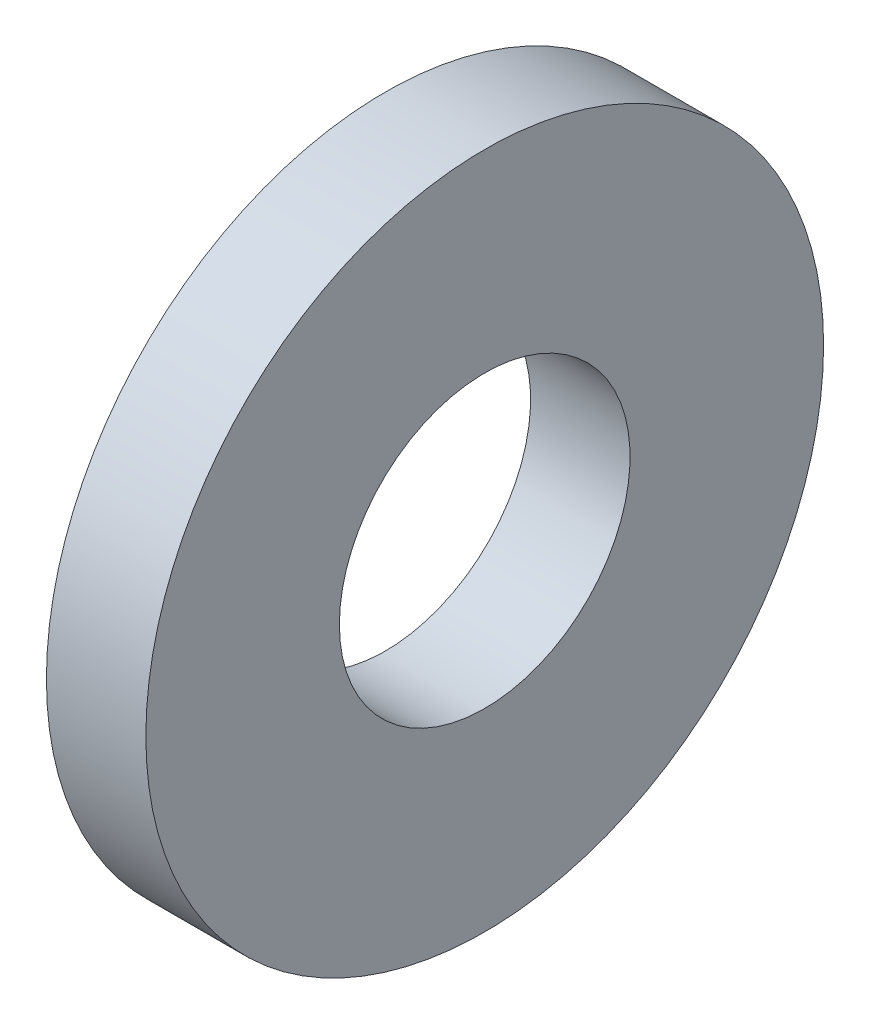
ISO-10303-21;
HEADER;
FILE_DESCRIPTION(('STEP AP214'),'2;1');
FILE_NAME('part.step','',(''),(''),'','','');
FILE_SCHEMA(('AUTOMOTIVE_DESIGN { 1 0 10303 214 1 1 1 1 }'));
ENDSEC;
DATA;
#1=APPLICATION_CONTEXT('core data for automotive mechanical design processes');
#2=APPLICATION_PROTOCOL_DEFINITION('international standard','automotive_design',2000,#1);
#3=PRODUCT_CONTEXT('',#1,'mechanical');
#4=PRODUCT('Part','Part','',(#3));
#5=PRODUCT_RELATED_PRODUCT_CATEGORY('part','',(#4));
#6=PRODUCT_DEFINITION_FORMATION('','',#4);
#7=PRODUCT_DEFINITION_CONTEXT('part definition',#1,'design');
#8=PRODUCT_DEFINITION('design','',#6,#7);
#9=PRODUCT_DEFINITION_SHAPE('','',#8);
#10=(LENGTH_UNIT() NAMED_UNIT(*) SI_UNIT(.MILLI.,.METRE.));
#11=(NAMED_UNIT(*) PLANE_ANGLE_UNIT() SI_UNIT($,.RADIAN.));
#12=(NAMED_UNIT(*) SI_UNIT($,.STERADIAN.) SOLID_ANGLE_UNIT());
#13=UNCERTAINTY_MEASURE_WITH_UNIT(LENGTH_MEASURE(1.E-05),#10,'distance_accuracy_value','');
#14=(GEOMETRIC_REPRESENTATION_CONTEXT(3) GLOBAL_UNCERTAINTY_ASSIGNED_CONTEXT((#13)) GLOBAL_UNIT_ASSIGNED_CONTEXT((#10,
#11,#12)) REPRESENTATION_CONTEXT('',''));
#15=CARTESIAN_POINT('',(0.,0.,0.));
#16=DIRECTION('',(0.,0.,1.));
#17=DIRECTION('',(1.,0.,0.));
#18=AXIS2_PLACEMENT_3D('',#15,#16,#17);
#19=CARTESIAN_POINT('',(1.651,0.,0.));
#20=DIRECTION('',(1.,0.,0.));
#21=DIRECTION('',(0.,0.,-1.));
#22=AXIS2_PLACEMENT_3D('',#19,#20,#21);
#23=PLANE('',#22);
#24=CARTESIAN_POINT('',(1.651,0.,0.));
#25=DIRECTION('',(1.,0.,0.));
#26=DIRECTION('',(0.,0.,-1.));
#27=AXIS2_PLACEMENT_3D('',#24,#25,#26);
#28=CIRCLE('',#27,5.6261);
#29=CARTESIAN_POINT('',(1.651,0.,5.6261));
#30=VERTEX_POINT('',#29);
#31=EDGE_CURVE('E10',#30,#30,#28,.T.);
#32=ORIENTED_EDGE('',*,*,#31,.T.);
#33=EDGE_LOOP('',(#32));
#34=FACE_BOUND('',#33,.T.);
#35=CARTESIAN_POINT('',(1.651,0.,0.));
#36=DIRECTION('',(1.,0.,0.));
#37=DIRECTION('',(0.,0.,-1.));
#38=AXIS2_PLACEMENT_3D('',#35,#36,#37);
#39=CIRCLE('',#38,2.413);
#40=CARTESIAN_POINT('',(1.651,0.,2.413));
#41=VERTEX_POINT('',#40);
#42=EDGE_CURVE('E41',#41,#41,#39,.T.);
#43=ORIENTED_EDGE('',*,*,#42,.F.);
#44=EDGE_LOOP('',(#43));
#45=FACE_BOUND('',#44,.T.);
#46=ADVANCED_FACE('F30',(#34,#45),#23,.T.);
#47=CARTESIAN_POINT('',(0.,0.,0.));
#48=DIRECTION('',(1.,0.,0.));
#49=DIRECTION('',(0.,0.,-1.));
#50=AXIS2_PLACEMENT_3D('',#47,#48,#49);
#51=PLANE('',#50);
#52=CARTESIAN_POINT('',(0.,0.,0.));
#53=DIRECTION('',(1.,0.,0.));
#54=DIRECTION('',(0.,0.,-1.));
#55=AXIS2_PLACEMENT_3D('',#52,#53,#54);
#56=CIRCLE('',#55,5.6261);
#57=CARTESIAN_POINT('',(0.,0.,5.6261));
#58=VERTEX_POINT('',#57);
#59=EDGE_CURVE('E34',#58,#58,#56,.T.);
#60=ORIENTED_EDGE('',*,*,#59,.F.);
#61=EDGE_LOOP('',(#60));
#62=FACE_BOUND('',#61,.T.);
#63=CARTESIAN_POINT('',(0.,0.,0.));
#64=DIRECTION('',(1.,0.,0.));
#65=DIRECTION('',(0.,0.,-1.));
#66=AXIS2_PLACEMENT_3D('',#63,#64,#65);
#67=CIRCLE('',#66,2.413);
#68=CARTESIAN_POINT('',(0.,0.,2.413));
#69=VERTEX_POINT('',#68);
#70=EDGE_CURVE('E43',#69,#69,#67,.T.);
#71=ORIENTED_EDGE('',*,*,#70,.T.);
#72=EDGE_LOOP('',(#71));
#73=FACE_BOUND('',#72,.T.);
#74=ADVANCED_FACE('F53',(#62,#73),#51,.F.);
#75=CARTESIAN_POINT('',(1.651,0.,0.));
#76=DIRECTION('',(-1.,0.,0.));
#77=DIRECTION('',(0.,0.,1.));
#78=AXIS2_PLACEMENT_3D('',#75,#76,#77);
#79=CYLINDRICAL_SURFACE('',#78,5.6261);
#80=CARTESIAN_POINT('',(1.651,0.,5.6261));
#81=CARTESIAN_POINT('',(1.63380208333333,0.,5.6261));
#82=CARTESIAN_POINT('',(1.61660416666667,0.,5.6261));
#83=CARTESIAN_POINT('',(1.58220833333333,0.,5.6261));
#84=CARTESIAN_POINT('',(1.56501041666667,0.,5.6261));
#85=CARTESIAN_POINT('',(1.53061458333333,0.,5.6261));
#86=CARTESIAN_POINT('',(1.51341666666667,0.,5.6261));
#87=CARTESIAN_POINT('',(1.47902083333333,0.,5.6261));
#88=CARTESIAN_POINT('',(1.46182291666667,0.,5.6261));
#89=CARTESIAN_POINT('',(1.42742708333333,0.,5.6261));
#90=CARTESIAN_POINT('',(1.41022916666667,0.,5.6261));
#91=CARTESIAN_POINT('',(1.37583333333333,0.,5.6261));
#92=CARTESIAN_POINT('',(1.35863541666667,0.,5.6261));
#93=CARTESIAN_POINT('',(1.32423958333333,0.,5.6261));
#94=CARTESIAN_POINT('',(1.30704166666667,0.,5.6261));
#95=CARTESIAN_POINT('',(1.27264583333333,0.,5.6261));
#96=CARTESIAN_POINT('',(1.25544791666667,0.,5.6261));
#97=CARTESIAN_POINT('',(1.22105208333333,0.,5.6261));
#98=CARTESIAN_POINT('',(1.20385416666667,0.,5.6261));
#99=CARTESIAN_POINT('',(1.16945833333333,0.,5.6261));
#100=CARTESIAN_POINT('',(1.15226041666667,0.,5.6261));
#101=CARTESIAN_POINT('',(1.11786458333333,0.,5.6261));
#102=CARTESIAN_POINT('',(1.10066666666667,0.,5.6261));
#103=CARTESIAN_POINT('',(1.06627083333333,0.,5.6261));
#104=CARTESIAN_POINT('',(1.04907291666667,0.,5.6261));
#105=CARTESIAN_POINT('',(1.01467708333333,0.,5.6261));
#106=CARTESIAN_POINT('',(0.997479166666666,0.,5.6261));
#107=CARTESIAN_POINT('',(0.963083333333333,0.,5.6261));
#108=CARTESIAN_POINT('',(0.945885416666667,0.,5.6261));
#109=CARTESIAN_POINT('',(0.911489583333333,0.,5.6261));
#110=CARTESIAN_POINT('',(0.894291666666667,0.,5.6261));
#111=CARTESIAN_POINT('',(0.859895833333333,0.,5.6261));
#112=CARTESIAN_POINT('',(0.842697916666667,0.,5.6261));
#113=CARTESIAN_POINT('',(0.808302083333333,0.,5.6261));
#114=CARTESIAN_POINT('',(0.791104166666667,0.,5.6261));
#115=CARTESIAN_POINT('',(0.756708333333333,0.,5.6261));
#116=CARTESIAN_POINT('',(0.739510416666667,0.,5.6261));
#117=CARTESIAN_POINT('',(0.705114583333333,0.,5.6261));
#118=CARTESIAN_POINT('',(0.687916666666667,0.,5.6261));
#119=CARTESIAN_POINT('',(0.653520833333333,0.,5.6261));
#120=CARTESIAN_POINT('',(0.636322916666667,0.,5.6261));
#121=CARTESIAN_POINT('',(0.601927083333333,0.,5.6261));
#122=CARTESIAN_POINT('',(0.584729166666667,0.,5.6261));
#123=CARTESIAN_POINT('',(0.550333333333333,0.,5.6261));
#124=CARTESIAN_POINT('',(0.533135416666667,0.,5.6261));
#125=CARTESIAN_POINT('',(0.498739583333333,0.,5.6261));
#126=CARTESIAN_POINT('',(0.481541666666667,0.,5.6261));
#127=CARTESIAN_POINT('',(0.447145833333333,0.,5.6261));
#128=CARTESIAN_POINT('',(0.429947916666667,0.,5.6261));
#129=CARTESIAN_POINT('',(0.395552083333333,0.,5.6261));
#130=CARTESIAN_POINT('',(0.378354166666667,0.,5.6261));
#131=CARTESIAN_POINT('',(0.343958333333333,0.,5.6261));
#132=CARTESIAN_POINT('',(0.326760416666667,0.,5.6261));
#133=CARTESIAN_POINT('',(0.292364583333333,0.,5.6261));
#134=CARTESIAN_POINT('',(0.275166666666667,0.,5.6261));
#135=CARTESIAN_POINT('',(0.240770833333333,0.,5.6261));
#136=CARTESIAN_POINT('',(0.223572916666667,0.,5.6261));
#137=CARTESIAN_POINT('',(0.189177083333333,0.,5.6261));
#138=CARTESIAN_POINT('',(0.171979166666667,0.,5.6261));
#139=CARTESIAN_POINT('',(0.137583333333333,0.,5.6261));
#140=CARTESIAN_POINT('',(0.120385416666667,0.,5.6261));
#141=CARTESIAN_POINT('',(0.0859895833333333,0.,5.6261));
#142=CARTESIAN_POINT('',(0.0687916666666667,0.,5.6261));
#143=CARTESIAN_POINT('',(0.0343958333333333,0.,5.6261));
#144=CARTESIAN_POINT('',(0.0171979166666666,0.,5.6261));
#145=CARTESIAN_POINT('',(0.,0.,5.6261));
#146=B_SPLINE_CURVE_WITH_KNOTS('',3,(#80,#81,#82,#83,#84,#85,#86,#87,#88,#89,#90,#91,#92,#93,
#94,#95,#96,#97,#98,#99,#100,#101,#102,#103,#104,#105,#106,#107,#108,#109,#110,#111,#112,#113,
#114,#115,#116,#117,#118,#119,#120,#121,#122,#123,#124,#125,#126,#127,#128,#129,#130,#131,#132,
#133,#134,#135,#136,#137,#138,#139,#140,#141,#142,#143,#144,#145),.UNSPECIFIED.,.F.,.F.,(4,2,2,
2,2,2,2,2,2,2,2,2,2,2,2,2,2,2,2,2,2,2,2,2,2,2,2,2,2,2,2,2,4),(0.,0.05159375,0.1031875,
0.15478125,0.206375,0.25796875,0.3095625,0.36115625,0.41275,0.46434375,0.5159375,0.56753125,
0.619125,0.67071875,0.7223125,0.77390625,0.8255,0.87709375,0.9286875,0.98028125,1.031875,
1.08346875,1.1350625,1.18665625,1.23825,1.28984375,1.3414375,1.39303125,1.444625,1.49621875,
1.5478125,1.59940625,1.651),.UNSPECIFIED.);
#147=EDGE_CURVE('BSEAM32',#30,#58,#146,.T.);
#148=ORIENTED_EDGE('',*,*,#31,.F.);
#149=ORIENTED_EDGE('',*,*,#59,.T.);
#150=ORIENTED_EDGE('',*,*,#147,.T.);
#151=ORIENTED_EDGE('',*,*,#147,.F.);
#152=EDGE_LOOP('',(#148,#150,#149,#151));
#153=FACE_BOUND('',#152,.T.);
#154=ADVANCED_FACE('F32',(#153),#79,.T.);
#155=CARTESIAN_POINT('',(1.651,0.,0.));
#156=DIRECTION('',(-1.,0.,0.));
#157=DIRECTION('',(0.,0.,1.));
#158=AXIS2_PLACEMENT_3D('',#155,#156,#157);
#159=CYLINDRICAL_SURFACE('',#158,2.413);
#160=CARTESIAN_POINT('',(1.651,0.,2.413));
#161=CARTESIAN_POINT('',(1.63380208333333,0.,2.413));
#162=CARTESIAN_POINT('',(1.61660416666667,0.,2.413));
#163=CARTESIAN_POINT('',(1.58220833333333,0.,2.413));
#164=CARTESIAN_POINT('',(1.56501041666667,0.,2.413));
#165=CARTESIAN_POINT('',(1.53061458333333,0.,2.413));
#166=CARTESIAN_POINT('',(1.51341666666667,0.,2.413));
#167=CARTESIAN_POINT('',(1.47902083333333,0.,2.413));
#168=CARTESIAN_POINT('',(1.46182291666667,0.,2.413));
#169=CARTESIAN_POINT('',(1.42742708333333,0.,2.413));
#170=CARTESIAN_POINT('',(1.41022916666667,0.,2.413));
#171=CARTESIAN_POINT('',(1.37583333333333,0.,2.413));
#172=CARTESIAN_POINT('',(1.35863541666667,0.,2.413));
#173=CARTESIAN_POINT('',(1.32423958333333,0.,2.413));
#174=CARTESIAN_POINT('',(1.30704166666667,0.,2.413));
#175=CARTESIAN_POINT('',(1.27264583333333,0.,2.413));
#176=CARTESIAN_POINT('',(1.25544791666667,0.,2.413));
#177=CARTESIAN_POINT('',(1.22105208333333,0.,2.413));
#178=CARTESIAN_POINT('',(1.20385416666667,0.,2.413));
#179=CARTESIAN_POINT('',(1.16945833333333,0.,2.413));
#180=CARTESIAN_POINT('',(1.15226041666667,0.,2.413));
#181=CARTESIAN_POINT('',(1.11786458333333,0.,2.413));
#182=CARTESIAN_POINT('',(1.10066666666667,0.,2.413));
#183=CARTESIAN_POINT('',(1.06627083333333,0.,2.413));
#184=CARTESIAN_POINT('',(1.04907291666667,0.,2.413));
#185=CARTESIAN_POINT('',(1.01467708333333,0.,2.413));
#186=CARTESIAN_POINT('',(0.997479166666666,0.,2.413));
#187=CARTESIAN_POINT('',(0.963083333333333,0.,2.413));
#188=CARTESIAN_POINT('',(0.945885416666666,0.,2.413));
#189=CARTESIAN_POINT('',(0.911489583333333,0.,2.413));
#190=CARTESIAN_POINT('',(0.894291666666666,0.,2.413));
#191=CARTESIAN_POINT('',(0.859895833333333,0.,2.413));
#192=CARTESIAN_POINT('',(0.842697916666666,0.,2.413));
#193=CARTESIAN_POINT('',(0.808302083333333,0.,2.413));
#194=CARTESIAN_POINT('',(0.791104166666666,0.,2.413));
#195=CARTESIAN_POINT('',(0.756708333333333,0.,2.413));
#196=CARTESIAN_POINT('',(0.739510416666667,0.,2.413));
#197=CARTESIAN_POINT('',(0.705114583333333,0.,2.413));
#198=CARTESIAN_POINT('',(0.687916666666667,0.,2.413));
#199=CARTESIAN_POINT('',(0.653520833333333,0.,2.413));
#200=CARTESIAN_POINT('',(0.636322916666667,0.,2.413));
#201=CARTESIAN_POINT('',(0.601927083333333,0.,2.413));
#202=CARTESIAN_POINT('',(0.584729166666667,0.,2.413));
#203=CARTESIAN_POINT('',(0.550333333333333,0.,2.413));
#204=CARTESIAN_POINT('',(0.533135416666667,0.,2.413));
#205=CARTESIAN_POINT('',(0.498739583333333,0.,2.413));
#206=CARTESIAN_POINT('',(0.481541666666667,0.,2.413));
#207=CARTESIAN_POINT('',(0.447145833333333,0.,2.413));
#208=CARTESIAN_POINT('',(0.429947916666667,0.,2.413));
#209=CARTESIAN_POINT('',(0.395552083333333,0.,2.413));
#210=CARTESIAN_POINT('',(0.378354166666667,0.,2.413));
#211=CARTESIAN_POINT('',(0.343958333333333,0.,2.413));
#212=CARTESIAN_POINT('',(0.326760416666667,0.,2.413));
#213=CARTESIAN_POINT('',(0.292364583333333,0.,2.413));
#214=CARTESIAN_POINT('',(0.275166666666667,0.,2.413));
#215=CARTESIAN_POINT('',(0.240770833333333,0.,2.413));
#216=CARTESIAN_POINT('',(0.223572916666667,0.,2.413));
#217=CARTESIAN_POINT('',(0.189177083333333,0.,2.413));
#218=CARTESIAN_POINT('',(0.171979166666667,0.,2.413));
#219=CARTESIAN_POINT('',(0.137583333333333,0.,2.413));
#220=CARTESIAN_POINT('',(0.120385416666667,0.,2.413));
#221=CARTESIAN_POINT('',(0.0859895833333333,0.,2.413));
#222=CARTESIAN_POINT('',(0.0687916666666667,0.,2.413));
#223=CARTESIAN_POINT('',(0.0343958333333333,0.,2.413));
#224=CARTESIAN_POINT('',(0.0171979166666666,0.,2.413));
#225=CARTESIAN_POINT('',(0.,0.,2.413));
#226=B_SPLINE_CURVE_WITH_KNOTS('',3,(#160,#161,#162,#163,#164,#165,#166,#167,#168,#169,#170,
#171,#172,#173,#174,#175,#176,#177,#178,#179,#180,#181,#182,#183,#184,#185,#186,#187,#188,#189,
#190,#191,#192,#193,#194,#195,#196,#197,#198,#199,#200,#201,#202,#203,#204,#205,#206,#207,#208,
#209,#210,#211,#212,#213,#214,#215,#216,#217,#218,#219,#220,#221,#222,#223,#224,#225),
.UNSPECIFIED.,.F.,.F.,(4,2,2,2,2,2,2,2,2,2,2,2,2,2,2,2,2,2,2,2,2,2,2,2,2,2,2,2,2,2,2,2,4),(0.,
0.0515937500000002,0.1031875,0.15478125,0.206375,0.25796875,0.3095625,0.36115625,0.41275,
0.46434375,0.5159375,0.56753125,0.619125,0.67071875,0.7223125,0.77390625,0.8255,0.87709375,
0.9286875,0.98028125,1.031875,1.08346875,1.1350625,1.18665625,1.23825,1.28984375,1.3414375,
1.39303125,1.444625,1.49621875,1.5478125,1.59940625,1.651),.UNSPECIFIED.);
#227=EDGE_CURVE('BSEAM49',#41,#69,#226,.T.);
#228=ORIENTED_EDGE('',*,*,#42,.T.);
#229=ORIENTED_EDGE('',*,*,#70,.F.);
#230=ORIENTED_EDGE('',*,*,#227,.T.);
#231=ORIENTED_EDGE('',*,*,#227,.F.);
#232=EDGE_LOOP('',(#228,#230,#229,#231));
#233=FACE_BOUND('',#232,.T.);
#234=ADVANCED_FACE('F49',(#233),#159,.F.);
#235=CLOSED_SHELL('',(#46,#74,#154,#234));
#236=MANIFOLD_SOLID_BREP('B2',#235);
#237=ADVANCED_BREP_SHAPE_REPRESENTATION('',(#18,#236),#14);
#238=SHAPE_DEFINITION_REPRESENTATION(#9,#237);
ENDSEC;
END-ISO-10303-21;
